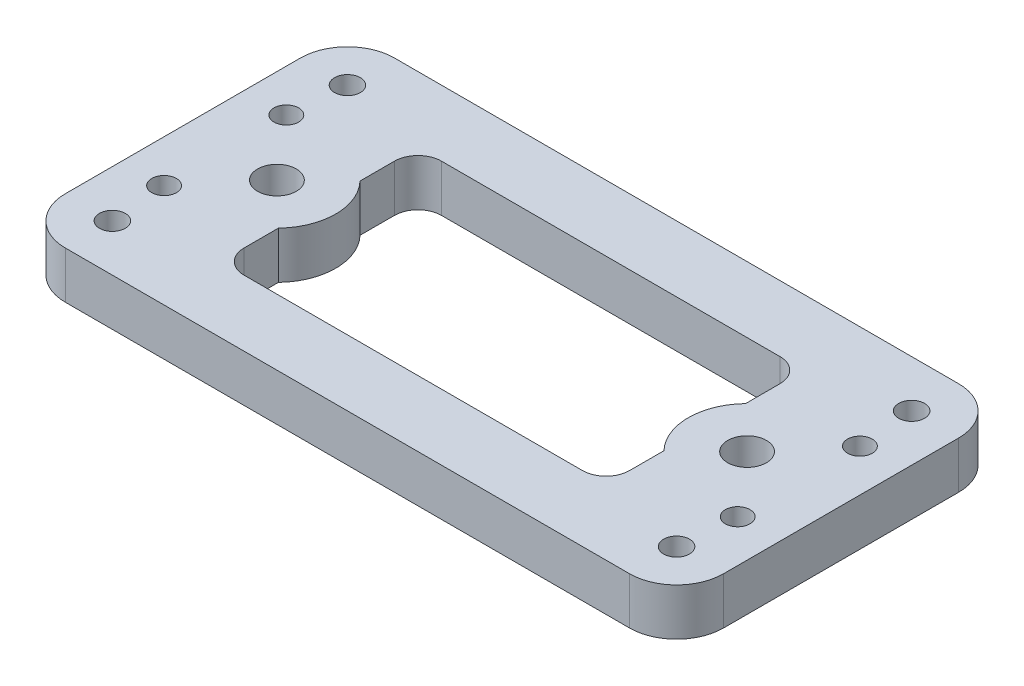
ISO-10303-21;
HEADER;
FILE_DESCRIPTION(('STEP AP214'),'2;1');
FILE_NAME('part.step','',(''),(''),'','','');
FILE_SCHEMA(('AUTOMOTIVE_DESIGN { 1 0 10303 214 1 1 1 1 }'));
ENDSEC;
DATA;
#1=APPLICATION_CONTEXT('core data for automotive mechanical design processes');
#2=APPLICATION_PROTOCOL_DEFINITION('international standard','automotive_design',2000,#1);
#3=PRODUCT_CONTEXT('',#1,'mechanical');
#4=PRODUCT('Part','Part','',(#3));
#5=PRODUCT_RELATED_PRODUCT_CATEGORY('part','',(#4));
#6=PRODUCT_DEFINITION_FORMATION('','',#4);
#7=PRODUCT_DEFINITION_CONTEXT('part definition',#1,'design');
#8=PRODUCT_DEFINITION('design','',#6,#7);
#9=PRODUCT_DEFINITION_SHAPE('','',#8);
#10=(LENGTH_UNIT() NAMED_UNIT(*) SI_UNIT(.MILLI.,.METRE.));
#11=(NAMED_UNIT(*) PLANE_ANGLE_UNIT() SI_UNIT($,.RADIAN.));
#12=(NAMED_UNIT(*) SI_UNIT($,.STERADIAN.) SOLID_ANGLE_UNIT());
#13=UNCERTAINTY_MEASURE_WITH_UNIT(LENGTH_MEASURE(1.E-05),#10,'distance_accuracy_value','');
#14=(GEOMETRIC_REPRESENTATION_CONTEXT(3) GLOBAL_UNCERTAINTY_ASSIGNED_CONTEXT((#13)) GLOBAL_UNIT_ASSIGNED_CONTEXT((#10,
#11,#12)) REPRESENTATION_CONTEXT('',''));
#15=CARTESIAN_POINT('',(0.,0.,0.));
#16=DIRECTION('',(0.,0.,1.));
#17=DIRECTION('',(1.,0.,0.));
#18=AXIS2_PLACEMENT_3D('',#15,#16,#17);
#19=CARTESIAN_POINT('',(41.,10.,-21.));
#20=DIRECTION('',(-1.,0.,0.));
#21=DIRECTION('',(0.,0.,1.));
#22=AXIS2_PLACEMENT_3D('',#19,#20,#21);
#23=PLANE('',#22);
#24=DIRECTION('',(0.,0.,-1.));
#25=VECTOR('',#24,1.);
#26=CARTESIAN_POINT('',(41.,0.,-21.));
#27=LINE('',#26,#25);
#28=CARTESIAN_POINT('',(41.,0.,16.));
#29=VERTEX_POINT('',#28);
#30=CARTESIAN_POINT('',(41.,0.,8.67467578644872));
#31=VERTEX_POINT('',#30);
#32=EDGE_CURVE('E266',#29,#31,#27,.T.);
#33=ORIENTED_EDGE('',*,*,#32,.F.);
#34=DIRECTION('',(0.,-1.,0.));
#35=VECTOR('',#34,1.);
#36=CARTESIAN_POINT('',(41.,10.,16.));
#37=LINE('',#36,#35);
#38=CARTESIAN_POINT('',(41.,10.,16.));
#39=VERTEX_POINT('',#38);
#40=EDGE_CURVE('E339',#29,#39,#37,.F.);
#41=ORIENTED_EDGE('',*,*,#40,.T.);
#42=DIRECTION('',(0.,0.,-1.));
#43=VECTOR('',#42,1.);
#44=CARTESIAN_POINT('',(41.,10.,-21.));
#45=LINE('',#44,#43);
#46=CARTESIAN_POINT('',(41.,10.,8.67467578644872));
#47=VERTEX_POINT('',#46);
#48=EDGE_CURVE('E182',#39,#47,#45,.T.);
#49=ORIENTED_EDGE('',*,*,#48,.T.);
#50=DIRECTION('',(0.,1.,0.));
#51=VECTOR('',#50,1.);
#52=CARTESIAN_POINT('',(41.,0.,8.67467578644872));
#53=LINE('',#52,#51);
#54=EDGE_CURVE('E194',#31,#47,#53,.T.);
#55=ORIENTED_EDGE('',*,*,#54,.F.);
#56=EDGE_LOOP('',(#33,#41,#49,#55));
#57=FACE_BOUND('',#56,.T.);
#58=ADVANCED_FACE('F35',(#57),#23,.T.);
#59=CARTESIAN_POINT('',(-41.,10.,-21.));
#60=DIRECTION('',(1.,0.,0.));
#61=DIRECTION('',(0.,0.,-1.));
#62=AXIS2_PLACEMENT_3D('',#59,#60,#61);
#63=PLANE('',#62);
#64=DIRECTION('',(0.,0.,1.));
#65=VECTOR('',#64,1.);
#66=CARTESIAN_POINT('',(-41.,0.,-21.));
#67=LINE('',#66,#65);
#68=CARTESIAN_POINT('',(-41.,0.,-16.));
#69=VERTEX_POINT('',#68);
#70=CARTESIAN_POINT('',(-41.,0.,-8.67467578644872));
#71=VERTEX_POINT('',#70);
#72=EDGE_CURVE('E271',#69,#71,#67,.T.);
#73=ORIENTED_EDGE('',*,*,#72,.F.);
#74=DIRECTION('',(0.,-1.,0.));
#75=VECTOR('',#74,1.);
#76=CARTESIAN_POINT('',(-41.,10.,-16.));
#77=LINE('',#76,#75);
#78=CARTESIAN_POINT('',(-41.,10.,-16.));
#79=VERTEX_POINT('',#78);
#80=EDGE_CURVE('E50',#69,#79,#77,.F.);
#81=ORIENTED_EDGE('',*,*,#80,.T.);
#82=DIRECTION('',(0.,0.,1.));
#83=VECTOR('',#82,1.);
#84=CARTESIAN_POINT('',(-41.,10.,-21.));
#85=LINE('',#84,#83);
#86=CARTESIAN_POINT('',(-41.,10.,-8.67467578644872));
#87=VERTEX_POINT('',#86);
#88=EDGE_CURVE('E260',#79,#87,#85,.T.);
#89=ORIENTED_EDGE('',*,*,#88,.T.);
#90=DIRECTION('',(0.,1.,0.));
#91=VECTOR('',#90,1.);
#92=CARTESIAN_POINT('',(-41.,0.,-8.67467578644872));
#93=LINE('',#92,#91);
#94=EDGE_CURVE('E212',#71,#87,#93,.T.);
#95=ORIENTED_EDGE('',*,*,#94,.F.);
#96=EDGE_LOOP('',(#73,#81,#89,#95));
#97=FACE_BOUND('',#96,.T.);
#98=ADVANCED_FACE('F401',(#97),#63,.T.);
#99=CARTESIAN_POINT('',(70.,10.,35.));
#100=DIRECTION('',(0.,1.,0.));
#101=DIRECTION('',(0.,0.,1.));
#102=AXIS2_PLACEMENT_3D('',#99,#100,#101);
#103=PLANE('',#102);
#104=CARTESIAN_POINT('',(61.,10.,13.));
#105=DIRECTION('',(0.,1.,0.));
#106=DIRECTION('',(0.,0.,1.));
#107=AXIS2_PLACEMENT_3D('',#104,#105,#106);
#108=CIRCLE('',#107,2.62500000000001);
#109=CARTESIAN_POINT('',(61.,10.,15.625));
#110=VERTEX_POINT('',#109);
#111=EDGE_CURVE('E742',#110,#110,#108,.T.);
#112=ORIENTED_EDGE('',*,*,#111,.F.);
#113=EDGE_LOOP('',(#112));
#114=FACE_BOUND('',#113,.T.);
#115=CARTESIAN_POINT('',(61.,10.,-13.));
#116=DIRECTION('',(0.,1.,0.));
#117=DIRECTION('',(0.,0.,1.));
#118=AXIS2_PLACEMENT_3D('',#115,#116,#117);
#119=CIRCLE('',#118,2.625);
#120=CARTESIAN_POINT('',(61.,10.,-10.375));
#121=VERTEX_POINT('',#120);
#122=EDGE_CURVE('E744',#121,#121,#119,.T.);
#123=ORIENTED_EDGE('',*,*,#122,.F.);
#124=EDGE_LOOP('',(#123));
#125=FACE_BOUND('',#124,.T.);
#126=CARTESIAN_POINT('',(-61.,10.,13.));
#127=DIRECTION('',(0.,1.,0.));
#128=DIRECTION('',(0.,0.,1.));
#129=AXIS2_PLACEMENT_3D('',#126,#127,#128);
#130=CIRCLE('',#129,2.625);
#131=CARTESIAN_POINT('',(-61.,10.,15.625));
#132=VERTEX_POINT('',#131);
#133=EDGE_CURVE('E748',#132,#132,#130,.T.);
#134=ORIENTED_EDGE('',*,*,#133,.F.);
#135=EDGE_LOOP('',(#134));
#136=FACE_BOUND('',#135,.T.);
#137=CARTESIAN_POINT('',(-61.,10.,-13.));
#138=DIRECTION('',(0.,1.,0.));
#139=DIRECTION('',(0.,0.,1.));
#140=AXIS2_PLACEMENT_3D('',#137,#138,#139);
#141=CIRCLE('',#140,2.625);
#142=CARTESIAN_POINT('',(-61.,10.,-10.375));
#143=VERTEX_POINT('',#142);
#144=EDGE_CURVE('E204',#143,#143,#141,.T.);
#145=ORIENTED_EDGE('',*,*,#144,.F.);
#146=EDGE_LOOP('',(#145));
#147=FACE_BOUND('',#146,.T.);
#148=CARTESIAN_POINT('',(50.,10.,0.));
#149=DIRECTION('',(0.,1.,0.));
#150=DIRECTION('',(0.,0.,-1.));
#151=AXIS2_PLACEMENT_3D('',#148,#149,#150);
#152=CIRCLE('',#151,4.12500000000001);
#153=CARTESIAN_POINT('',(50.,10.,-4.12500000000001));
#154=VERTEX_POINT('',#153);
#155=EDGE_CURVE('E218',#154,#154,#152,.T.);
#156=ORIENTED_EDGE('',*,*,#155,.F.);
#157=EDGE_LOOP('',(#156));
#158=FACE_BOUND('',#157,.T.);
#159=CARTESIAN_POINT('',(-50.,10.,0.));
#160=DIRECTION('',(0.,1.,0.));
#161=DIRECTION('',(0.,0.,1.));
#162=AXIS2_PLACEMENT_3D('',#159,#160,#161);
#163=CIRCLE('',#162,4.12500000000001);
#164=CARTESIAN_POINT('',(-50.,10.,4.12500000000001));
#165=VERTEX_POINT('',#164);
#166=EDGE_CURVE('E224',#165,#165,#163,.T.);
#167=ORIENTED_EDGE('',*,*,#166,.F.);
#168=EDGE_LOOP('',(#167));
#169=FACE_BOUND('',#168,.T.);
#170=CARTESIAN_POINT('',(60.,10.,-25.));
#171=DIRECTION('',(0.,1.,0.));
#172=DIRECTION('',(0.,0.,1.));
#173=AXIS2_PLACEMENT_3D('',#170,#171,#172);
#174=CIRCLE('',#173,2.75);
#175=CARTESIAN_POINT('',(60.,10.,-22.25));
#176=VERTEX_POINT('',#175);
#177=EDGE_CURVE('E230',#176,#176,#174,.T.);
#178=ORIENTED_EDGE('',*,*,#177,.F.);
#179=EDGE_LOOP('',(#178));
#180=FACE_BOUND('',#179,.T.);
#181=CARTESIAN_POINT('',(60.,10.,25.));
#182=DIRECTION('',(0.,1.,0.));
#183=DIRECTION('',(0.,0.,-1.));
#184=AXIS2_PLACEMENT_3D('',#181,#182,#183);
#185=CIRCLE('',#184,2.75);
#186=CARTESIAN_POINT('',(60.,10.,22.25));
#187=VERTEX_POINT('',#186);
#188=EDGE_CURVE('E236',#187,#187,#185,.T.);
#189=ORIENTED_EDGE('',*,*,#188,.F.);
#190=EDGE_LOOP('',(#189));
#191=FACE_BOUND('',#190,.T.);
#192=CARTESIAN_POINT('',(-60.,10.,-25.));
#193=DIRECTION('',(0.,1.,0.));
#194=DIRECTION('',(0.,0.,-1.));
#195=AXIS2_PLACEMENT_3D('',#192,#193,#194);
#196=CIRCLE('',#195,2.75);
#197=CARTESIAN_POINT('',(-60.,10.,-27.75));
#198=VERTEX_POINT('',#197);
#199=EDGE_CURVE('E242',#198,#198,#196,.T.);
#200=ORIENTED_EDGE('',*,*,#199,.F.);
#201=EDGE_LOOP('',(#200));
#202=FACE_BOUND('',#201,.T.);
#203=CARTESIAN_POINT('',(-60.,10.,25.));
#204=DIRECTION('',(0.,1.,0.));
#205=DIRECTION('',(0.,0.,1.));
#206=AXIS2_PLACEMENT_3D('',#203,#204,#205);
#207=CIRCLE('',#206,2.75);
#208=CARTESIAN_POINT('',(-60.,10.,27.75));
#209=VERTEX_POINT('',#208);
#210=EDGE_CURVE('E248',#209,#209,#207,.T.);
#211=ORIENTED_EDGE('',*,*,#210,.F.);
#212=EDGE_LOOP('',(#211));
#213=FACE_BOUND('',#212,.T.);
#214=DIRECTION('',(1.,0.,0.));
#215=VECTOR('',#214,1.);
#216=CARTESIAN_POINT('',(-70.,10.,35.));
#217=LINE('',#216,#215);
#218=CARTESIAN_POINT('',(-60.,10.,35.));
#219=VERTEX_POINT('',#218);
#220=CARTESIAN_POINT('',(60.,10.,35.));
#221=VERTEX_POINT('',#220);
#222=EDGE_CURVE('E285',#219,#221,#217,.T.);
#223=ORIENTED_EDGE('',*,*,#222,.T.);
#224=CARTESIAN_POINT('',(60.,10.,25.));
#225=DIRECTION('',(0.,1.,0.));
#226=DIRECTION('',(0.,0.,1.));
#227=AXIS2_PLACEMENT_3D('',#224,#225,#226);
#228=CIRCLE('',#227,10.);
#229=CARTESIAN_POINT('',(70.,10.,25.));
#230=VERTEX_POINT('',#229);
#231=EDGE_CURVE('E322',#221,#230,#228,.T.);
#232=ORIENTED_EDGE('',*,*,#231,.T.);
#233=DIRECTION('',(0.,0.,-1.));
#234=VECTOR('',#233,1.);
#235=CARTESIAN_POINT('',(70.,10.,-35.));
#236=LINE('',#235,#234);
#237=CARTESIAN_POINT('',(70.,10.,-25.));
#238=VERTEX_POINT('',#237);
#239=EDGE_CURVE('E275',#230,#238,#236,.T.);
#240=ORIENTED_EDGE('',*,*,#239,.T.);
#241=CARTESIAN_POINT('',(60.,10.,-25.));
#242=DIRECTION('',(0.,1.,0.));
#243=DIRECTION('',(0.,0.,1.));
#244=AXIS2_PLACEMENT_3D('',#241,#242,#243);
#245=CIRCLE('',#244,10.);
#246=CARTESIAN_POINT('',(60.,10.,-35.));
#247=VERTEX_POINT('',#246);
#248=EDGE_CURVE('E320',#238,#247,#245,.T.);
#249=ORIENTED_EDGE('',*,*,#248,.T.);
#250=DIRECTION('',(-1.,0.,0.));
#251=VECTOR('',#250,1.);
#252=CARTESIAN_POINT('',(-70.,10.,-35.));
#253=LINE('',#252,#251);
#254=CARTESIAN_POINT('',(-60.,10.,-35.));
#255=VERTEX_POINT('',#254);
#256=EDGE_CURVE('E278',#247,#255,#253,.T.);
#257=ORIENTED_EDGE('',*,*,#256,.T.);
#258=CARTESIAN_POINT('',(-60.,10.,-25.));
#259=DIRECTION('',(0.,1.,0.));
#260=DIRECTION('',(0.,0.,1.));
#261=AXIS2_PLACEMENT_3D('',#258,#259,#260);
#262=CIRCLE('',#261,10.);
#263=CARTESIAN_POINT('',(-70.,10.,-25.));
#264=VERTEX_POINT('',#263);
#265=EDGE_CURVE('E318',#255,#264,#262,.T.);
#266=ORIENTED_EDGE('',*,*,#265,.T.);
#267=DIRECTION('',(0.,0.,1.));
#268=VECTOR('',#267,1.);
#269=CARTESIAN_POINT('',(-70.,10.,-35.));
#270=LINE('',#269,#268);
#271=CARTESIAN_POINT('',(-70.,10.,25.));
#272=VERTEX_POINT('',#271);
#273=EDGE_CURVE('E282',#264,#272,#270,.T.);
#274=ORIENTED_EDGE('',*,*,#273,.T.);
#275=CARTESIAN_POINT('',(-60.,10.,25.));
#276=DIRECTION('',(0.,1.,0.));
#277=DIRECTION('',(0.,0.,1.));
#278=AXIS2_PLACEMENT_3D('',#275,#276,#277);
#279=CIRCLE('',#278,10.);
#280=EDGE_CURVE('E316',#272,#219,#279,.T.);
#281=ORIENTED_EDGE('',*,*,#280,.T.);
#282=EDGE_LOOP('',(#223,#232,#240,#249,#257,#266,#274,#281));
#283=FACE_BOUND('',#282,.T.);
#284=DIRECTION('',(-1.,0.,0.));
#285=VECTOR('',#284,1.);
#286=CARTESIAN_POINT('',(-41.,10.,-21.));
#287=LINE('',#286,#285);
#288=CARTESIAN_POINT('',(36.,10.,-21.));
#289=VERTEX_POINT('',#288);
#290=CARTESIAN_POINT('',(-36.,10.,-21.));
#291=VERTEX_POINT('',#290);
#292=EDGE_CURVE('E256',#289,#291,#287,.T.);
#293=ORIENTED_EDGE('',*,*,#292,.F.);
#294=CARTESIAN_POINT('',(36.,10.,-16.));
#295=DIRECTION('',(0.,1.,0.));
#296=DIRECTION('',(0.,0.,1.));
#297=AXIS2_PLACEMENT_3D('',#294,#295,#296);
#298=CIRCLE('',#297,5.);
#299=CARTESIAN_POINT('',(41.,10.,-16.));
#300=VERTEX_POINT('',#299);
#301=EDGE_CURVE('E178',#289,#300,#298,.F.);
#302=ORIENTED_EDGE('',*,*,#301,.T.);
#303=CARTESIAN_POINT('',(41.,10.,-8.67467578644872));
#304=VERTEX_POINT('',#303);
#305=EDGE_CURVE('E170',#304,#300,#45,.T.);
#306=ORIENTED_EDGE('',*,*,#305,.F.);
#307=CARTESIAN_POINT('',(50.,10.,0.));
#308=DIRECTION('',(0.,1.,0.));
#309=DIRECTION('',(0.,0.,1.));
#310=AXIS2_PLACEMENT_3D('',#307,#308,#309);
#311=CIRCLE('',#310,12.5);
#312=EDGE_CURVE('E176',#304,#47,#311,.T.);
#313=ORIENTED_EDGE('',*,*,#312,.T.);
#314=ORIENTED_EDGE('',*,*,#48,.F.);
#315=CARTESIAN_POINT('',(36.,10.,16.));
#316=DIRECTION('',(0.,1.,0.));
#317=DIRECTION('',(0.,0.,1.));
#318=AXIS2_PLACEMENT_3D('',#315,#316,#317);
#319=CIRCLE('',#318,5.);
#320=CARTESIAN_POINT('',(36.,10.,21.));
#321=VERTEX_POINT('',#320);
#322=EDGE_CURVE('E354',#39,#321,#319,.F.);
#323=ORIENTED_EDGE('',*,*,#322,.T.);
#324=DIRECTION('',(1.,0.,0.));
#325=VECTOR('',#324,1.);
#326=CARTESIAN_POINT('',(-41.,10.,21.));
#327=LINE('',#326,#325);
#328=CARTESIAN_POINT('',(-36.,10.,21.));
#329=VERTEX_POINT('',#328);
#330=EDGE_CURVE('E262',#329,#321,#327,.T.);
#331=ORIENTED_EDGE('',*,*,#330,.F.);
#332=CARTESIAN_POINT('',(-36.,10.,16.));
#333=DIRECTION('',(0.,1.,0.));
#334=DIRECTION('',(0.,0.,1.));
#335=AXIS2_PLACEMENT_3D('',#332,#333,#334);
#336=CIRCLE('',#335,5.);
#337=CARTESIAN_POINT('',(-41.,10.,16.));
#338=VERTEX_POINT('',#337);
#339=EDGE_CURVE('E361',#329,#338,#336,.F.);
#340=ORIENTED_EDGE('',*,*,#339,.T.);
#341=CARTESIAN_POINT('',(-41.,10.,8.67467578644872));
#342=VERTEX_POINT('',#341);
#343=EDGE_CURVE('E259',#342,#338,#85,.T.);
#344=ORIENTED_EDGE('',*,*,#343,.F.);
#345=CARTESIAN_POINT('',(-50.,10.,0.));
#346=DIRECTION('',(0.,1.,0.));
#347=DIRECTION('',(0.,0.,-1.));
#348=AXIS2_PLACEMENT_3D('',#345,#346,#347);
#349=CIRCLE('',#348,12.5);
#350=EDGE_CURVE('E193',#342,#87,#349,.T.);
#351=ORIENTED_EDGE('',*,*,#350,.T.);
#352=ORIENTED_EDGE('',*,*,#88,.F.);
#353=CARTESIAN_POINT('',(-36.,10.,-16.));
#354=DIRECTION('',(0.,1.,0.));
#355=DIRECTION('',(0.,0.,1.));
#356=AXIS2_PLACEMENT_3D('',#353,#354,#355);
#357=CIRCLE('',#356,5.);
#358=EDGE_CURVE('E11',#79,#291,#357,.F.);
#359=ORIENTED_EDGE('',*,*,#358,.T.);
#360=EDGE_LOOP('',(#293,#302,#306,#313,#314,#323,#331,#340,#344,#351,#352,#359));
#361=FACE_BOUND('',#360,.T.);
#362=ADVANCED_FACE('F173',(#114,#125,#136,#147,#158,#169,#180,#191,#202,#213,#283,#361),#103,.T.);
#363=CARTESIAN_POINT('',(70.,0.,35.));
#364=DIRECTION('',(0.,1.,0.));
#365=DIRECTION('',(0.,0.,1.));
#366=AXIS2_PLACEMENT_3D('',#363,#364,#365);
#367=PLANE('',#366);
#368=CARTESIAN_POINT('',(61.,0.,13.));
#369=DIRECTION('',(0.,1.,0.));
#370=DIRECTION('',(0.,0.,1.));
#371=AXIS2_PLACEMENT_3D('',#368,#369,#370);
#372=CIRCLE('',#371,2.62500000000001);
#373=CARTESIAN_POINT('',(61.,0.,15.625));
#374=VERTEX_POINT('',#373);
#375=EDGE_CURVE('E486',#374,#374,#372,.T.);
#376=ORIENTED_EDGE('',*,*,#375,.T.);
#377=EDGE_LOOP('',(#376));
#378=FACE_BOUND('',#377,.T.);
#379=CARTESIAN_POINT('',(61.,0.,-13.));
#380=DIRECTION('',(0.,1.,0.));
#381=DIRECTION('',(0.,0.,1.));
#382=AXIS2_PLACEMENT_3D('',#379,#380,#381);
#383=CIRCLE('',#382,2.625);
#384=CARTESIAN_POINT('',(61.,0.,-10.375));
#385=VERTEX_POINT('',#384);
#386=EDGE_CURVE('E490',#385,#385,#383,.T.);
#387=ORIENTED_EDGE('',*,*,#386,.T.);
#388=EDGE_LOOP('',(#387));
#389=FACE_BOUND('',#388,.T.);
#390=CARTESIAN_POINT('',(-61.,0.,13.));
#391=DIRECTION('',(0.,1.,0.));
#392=DIRECTION('',(0.,0.,1.));
#393=AXIS2_PLACEMENT_3D('',#390,#391,#392);
#394=CIRCLE('',#393,2.625);
#395=CARTESIAN_POINT('',(-61.,0.,15.625));
#396=VERTEX_POINT('',#395);
#397=EDGE_CURVE('E494',#396,#396,#394,.T.);
#398=ORIENTED_EDGE('',*,*,#397,.T.);
#399=EDGE_LOOP('',(#398));
#400=FACE_BOUND('',#399,.T.);
#401=CARTESIAN_POINT('',(-61.,0.,-13.));
#402=DIRECTION('',(0.,1.,0.));
#403=DIRECTION('',(0.,0.,1.));
#404=AXIS2_PLACEMENT_3D('',#401,#402,#403);
#405=CIRCLE('',#404,2.625);
#406=CARTESIAN_POINT('',(-61.,0.,-10.375));
#407=VERTEX_POINT('',#406);
#408=EDGE_CURVE('E200',#407,#407,#405,.T.);
#409=ORIENTED_EDGE('',*,*,#408,.T.);
#410=EDGE_LOOP('',(#409));
#411=FACE_BOUND('',#410,.T.);
#412=CARTESIAN_POINT('',(50.,0.,0.));
#413=DIRECTION('',(0.,1.,0.));
#414=DIRECTION('',(0.,0.,-1.));
#415=AXIS2_PLACEMENT_3D('',#412,#413,#414);
#416=CIRCLE('',#415,4.12500000000001);
#417=CARTESIAN_POINT('',(50.,0.,-4.12500000000001));
#418=VERTEX_POINT('',#417);
#419=EDGE_CURVE('E221',#418,#418,#416,.T.);
#420=ORIENTED_EDGE('',*,*,#419,.T.);
#421=EDGE_LOOP('',(#420));
#422=FACE_BOUND('',#421,.T.);
#423=CARTESIAN_POINT('',(-50.,0.,0.));
#424=DIRECTION('',(0.,1.,0.));
#425=DIRECTION('',(0.,0.,1.));
#426=AXIS2_PLACEMENT_3D('',#423,#424,#425);
#427=CIRCLE('',#426,4.12500000000001);
#428=CARTESIAN_POINT('',(-50.,0.,4.12500000000001));
#429=VERTEX_POINT('',#428);
#430=EDGE_CURVE('E227',#429,#429,#427,.T.);
#431=ORIENTED_EDGE('',*,*,#430,.T.);
#432=EDGE_LOOP('',(#431));
#433=FACE_BOUND('',#432,.T.);
#434=CARTESIAN_POINT('',(60.,0.,-25.));
#435=DIRECTION('',(0.,1.,0.));
#436=DIRECTION('',(0.,0.,1.));
#437=AXIS2_PLACEMENT_3D('',#434,#435,#436);
#438=CIRCLE('',#437,2.75);
#439=CARTESIAN_POINT('',(60.,0.,-22.25));
#440=VERTEX_POINT('',#439);
#441=EDGE_CURVE('E233',#440,#440,#438,.T.);
#442=ORIENTED_EDGE('',*,*,#441,.T.);
#443=EDGE_LOOP('',(#442));
#444=FACE_BOUND('',#443,.T.);
#445=CARTESIAN_POINT('',(60.,0.,25.));
#446=DIRECTION('',(0.,1.,0.));
#447=DIRECTION('',(0.,0.,-1.));
#448=AXIS2_PLACEMENT_3D('',#445,#446,#447);
#449=CIRCLE('',#448,2.75);
#450=CARTESIAN_POINT('',(60.,0.,22.25));
#451=VERTEX_POINT('',#450);
#452=EDGE_CURVE('E239',#451,#451,#449,.T.);
#453=ORIENTED_EDGE('',*,*,#452,.T.);
#454=EDGE_LOOP('',(#453));
#455=FACE_BOUND('',#454,.T.);
#456=CARTESIAN_POINT('',(-60.,0.,-25.));
#457=DIRECTION('',(0.,1.,0.));
#458=DIRECTION('',(0.,0.,-1.));
#459=AXIS2_PLACEMENT_3D('',#456,#457,#458);
#460=CIRCLE('',#459,2.75);
#461=CARTESIAN_POINT('',(-60.,0.,-27.75));
#462=VERTEX_POINT('',#461);
#463=EDGE_CURVE('E245',#462,#462,#460,.T.);
#464=ORIENTED_EDGE('',*,*,#463,.T.);
#465=EDGE_LOOP('',(#464));
#466=FACE_BOUND('',#465,.T.);
#467=CARTESIAN_POINT('',(-60.,0.,25.));
#468=DIRECTION('',(0.,1.,0.));
#469=DIRECTION('',(0.,0.,1.));
#470=AXIS2_PLACEMENT_3D('',#467,#468,#469);
#471=CIRCLE('',#470,2.75);
#472=CARTESIAN_POINT('',(-60.,0.,27.75));
#473=VERTEX_POINT('',#472);
#474=EDGE_CURVE('E251',#473,#473,#471,.T.);
#475=ORIENTED_EDGE('',*,*,#474,.T.);
#476=EDGE_LOOP('',(#475));
#477=FACE_BOUND('',#476,.T.);
#478=DIRECTION('',(0.,0.,-1.));
#479=VECTOR('',#478,1.);
#480=CARTESIAN_POINT('',(70.,0.,-35.));
#481=LINE('',#480,#479);
#482=CARTESIAN_POINT('',(70.,0.,25.));
#483=VERTEX_POINT('',#482);
#484=CARTESIAN_POINT('',(70.,0.,-25.));
#485=VERTEX_POINT('',#484);
#486=EDGE_CURVE('E265',#483,#485,#481,.T.);
#487=ORIENTED_EDGE('',*,*,#486,.F.);
#488=CARTESIAN_POINT('',(60.,0.,25.));
#489=DIRECTION('',(0.,1.,0.));
#490=DIRECTION('',(0.,0.,1.));
#491=AXIS2_PLACEMENT_3D('',#488,#489,#490);
#492=CIRCLE('',#491,10.);
#493=CARTESIAN_POINT('',(60.,0.,35.));
#494=VERTEX_POINT('',#493);
#495=EDGE_CURVE('E309',#483,#494,#492,.F.);
#496=ORIENTED_EDGE('',*,*,#495,.T.);
#497=DIRECTION('',(1.,0.,0.));
#498=VECTOR('',#497,1.);
#499=CARTESIAN_POINT('',(-70.,0.,35.));
#500=LINE('',#499,#498);
#501=CARTESIAN_POINT('',(-60.,0.,35.));
#502=VERTEX_POINT('',#501);
#503=EDGE_CURVE('E279',#502,#494,#500,.T.);
#504=ORIENTED_EDGE('',*,*,#503,.F.);
#505=CARTESIAN_POINT('',(-60.,0.,25.));
#506=DIRECTION('',(0.,1.,0.));
#507=DIRECTION('',(0.,0.,1.));
#508=AXIS2_PLACEMENT_3D('',#505,#506,#507);
#509=CIRCLE('',#508,10.);
#510=CARTESIAN_POINT('',(-70.,0.,25.));
#511=VERTEX_POINT('',#510);
#512=EDGE_CURVE('E303',#502,#511,#509,.F.);
#513=ORIENTED_EDGE('',*,*,#512,.T.);
#514=DIRECTION('',(0.,0.,1.));
#515=VECTOR('',#514,1.);
#516=CARTESIAN_POINT('',(-70.,0.,-35.));
#517=LINE('',#516,#515);
#518=CARTESIAN_POINT('',(-70.,0.,-25.));
#519=VERTEX_POINT('',#518);
#520=EDGE_CURVE('E294',#519,#511,#517,.T.);
#521=ORIENTED_EDGE('',*,*,#520,.F.);
#522=CARTESIAN_POINT('',(-60.,0.,-25.));
#523=DIRECTION('',(0.,1.,0.));
#524=DIRECTION('',(0.,0.,1.));
#525=AXIS2_PLACEMENT_3D('',#522,#523,#524);
#526=CIRCLE('',#525,10.);
#527=CARTESIAN_POINT('',(-60.,0.,-35.));
#528=VERTEX_POINT('',#527);
#529=EDGE_CURVE('E305',#519,#528,#526,.F.);
#530=ORIENTED_EDGE('',*,*,#529,.T.);
#531=DIRECTION('',(-1.,0.,0.));
#532=VECTOR('',#531,1.);
#533=CARTESIAN_POINT('',(-70.,0.,-35.));
#534=LINE('',#533,#532);
#535=CARTESIAN_POINT('',(60.,0.,-35.));
#536=VERTEX_POINT('',#535);
#537=EDGE_CURVE('E291',#536,#528,#534,.T.);
#538=ORIENTED_EDGE('',*,*,#537,.F.);
#539=CARTESIAN_POINT('',(60.,0.,-25.));
#540=DIRECTION('',(0.,1.,0.));
#541=DIRECTION('',(0.,0.,1.));
#542=AXIS2_PLACEMENT_3D('',#539,#540,#541);
#543=CIRCLE('',#542,10.);
#544=EDGE_CURVE('E307',#536,#485,#543,.F.);
#545=ORIENTED_EDGE('',*,*,#544,.T.);
#546=EDGE_LOOP('',(#487,#496,#504,#513,#521,#530,#538,#545));
#547=FACE_BOUND('',#546,.T.);
#548=DIRECTION('',(1.,0.,0.));
#549=VECTOR('',#548,1.);
#550=CARTESIAN_POINT('',(-41.,0.,21.));
#551=LINE('',#550,#549);
#552=CARTESIAN_POINT('',(-36.,0.,21.));
#553=VERTEX_POINT('',#552);
#554=CARTESIAN_POINT('',(36.,0.,21.));
#555=VERTEX_POINT('',#554);
#556=EDGE_CURVE('E183',#553,#555,#551,.T.);
#557=ORIENTED_EDGE('',*,*,#556,.T.);
#558=CARTESIAN_POINT('',(36.,0.,16.));
#559=DIRECTION('',(0.,1.,0.));
#560=DIRECTION('',(0.,0.,1.));
#561=AXIS2_PLACEMENT_3D('',#558,#559,#560);
#562=CIRCLE('',#561,5.);
#563=EDGE_CURVE('E352',#555,#29,#562,.T.);
#564=ORIENTED_EDGE('',*,*,#563,.T.);
#565=ORIENTED_EDGE('',*,*,#32,.T.);
#566=CARTESIAN_POINT('',(50.,0.,0.));
#567=DIRECTION('',(0.,1.,0.));
#568=DIRECTION('',(0.,0.,1.));
#569=AXIS2_PLACEMENT_3D('',#566,#567,#568);
#570=CIRCLE('',#569,12.5);
#571=CARTESIAN_POINT('',(41.,0.,-8.67467578644872));
#572=VERTEX_POINT('',#571);
#573=EDGE_CURVE('E199',#572,#31,#570,.T.);
#574=ORIENTED_EDGE('',*,*,#573,.F.);
#575=CARTESIAN_POINT('',(41.,0.,-16.));
#576=VERTEX_POINT('',#575);
#577=EDGE_CURVE('E189',#572,#576,#27,.T.);
#578=ORIENTED_EDGE('',*,*,#577,.T.);
#579=CARTESIAN_POINT('',(36.,0.,-16.));
#580=DIRECTION('',(0.,1.,0.));
#581=DIRECTION('',(0.,0.,1.));
#582=AXIS2_PLACEMENT_3D('',#579,#580,#581);
#583=CIRCLE('',#582,5.);
#584=CARTESIAN_POINT('',(36.,0.,-21.));
#585=VERTEX_POINT('',#584);
#586=EDGE_CURVE('E356',#576,#585,#583,.T.);
#587=ORIENTED_EDGE('',*,*,#586,.T.);
#588=DIRECTION('',(-1.,0.,0.));
#589=VECTOR('',#588,1.);
#590=CARTESIAN_POINT('',(-41.,0.,-21.));
#591=LINE('',#590,#589);
#592=CARTESIAN_POINT('',(-36.,0.,-21.));
#593=VERTEX_POINT('',#592);
#594=EDGE_CURVE('E268',#585,#593,#591,.T.);
#595=ORIENTED_EDGE('',*,*,#594,.T.);
#596=CARTESIAN_POINT('',(-36.,0.,-16.));
#597=DIRECTION('',(0.,1.,0.));
#598=DIRECTION('',(0.,0.,1.));
#599=AXIS2_PLACEMENT_3D('',#596,#597,#598);
#600=CIRCLE('',#599,5.);
#601=EDGE_CURVE('E43',#593,#69,#600,.T.);
#602=ORIENTED_EDGE('',*,*,#601,.T.);
#603=ORIENTED_EDGE('',*,*,#72,.T.);
#604=CARTESIAN_POINT('',(-50.,0.,0.));
#605=DIRECTION('',(0.,1.,0.));
#606=DIRECTION('',(0.,0.,-1.));
#607=AXIS2_PLACEMENT_3D('',#604,#605,#606);
#608=CIRCLE('',#607,12.5);
#609=CARTESIAN_POINT('',(-41.,0.,8.67467578644872));
#610=VERTEX_POINT('',#609);
#611=EDGE_CURVE('E209',#610,#71,#608,.T.);
#612=ORIENTED_EDGE('',*,*,#611,.F.);
#613=CARTESIAN_POINT('',(-41.,0.,16.));
#614=VERTEX_POINT('',#613);
#615=EDGE_CURVE('E270',#610,#614,#67,.T.);
#616=ORIENTED_EDGE('',*,*,#615,.T.);
#617=CARTESIAN_POINT('',(-36.,0.,16.));
#618=DIRECTION('',(0.,1.,0.));
#619=DIRECTION('',(0.,0.,1.));
#620=AXIS2_PLACEMENT_3D('',#617,#618,#619);
#621=CIRCLE('',#620,5.);
#622=EDGE_CURVE('E359',#614,#553,#621,.T.);
#623=ORIENTED_EDGE('',*,*,#622,.T.);
#624=EDGE_LOOP('',(#557,#564,#565,#574,#578,#587,#595,#602,#603,#612,#616,#623));
#625=FACE_BOUND('',#624,.T.);
#626=ADVANCED_FACE('F375',(#378,#389,#400,#411,#422,#433,#444,#455,#466,#477,#547,#625),#367,.F.);
#627=CARTESIAN_POINT('',(70.,10.,-35.));
#628=DIRECTION('',(-1.,0.,0.));
#629=DIRECTION('',(0.,0.,1.));
#630=AXIS2_PLACEMENT_3D('',#627,#628,#629);
#631=PLANE('',#630);
#632=ORIENTED_EDGE('',*,*,#239,.F.);
#633=DIRECTION('',(0.,-1.,0.));
#634=VECTOR('',#633,1.);
#635=CARTESIAN_POINT('',(70.,10.,25.));
#636=LINE('',#635,#634);
#637=EDGE_CURVE('E300',#230,#483,#636,.T.);
#638=ORIENTED_EDGE('',*,*,#637,.T.);
#639=ORIENTED_EDGE('',*,*,#486,.T.);
#640=DIRECTION('',(0.,-1.,0.));
#641=VECTOR('',#640,1.);
#642=CARTESIAN_POINT('',(70.,10.,-25.));
#643=LINE('',#642,#641);
#644=EDGE_CURVE('E288',#485,#238,#643,.F.);
#645=ORIENTED_EDGE('',*,*,#644,.T.);
#646=EDGE_LOOP('',(#632,#638,#639,#645));
#647=FACE_BOUND('',#646,.T.);
#648=ADVANCED_FACE('F428',(#647),#631,.F.);
#649=CARTESIAN_POINT('',(-70.,10.,-35.));
#650=DIRECTION('',(0.,0.,1.));
#651=DIRECTION('',(1.,0.,0.));
#652=AXIS2_PLACEMENT_3D('',#649,#650,#651);
#653=PLANE('',#652);
#654=ORIENTED_EDGE('',*,*,#256,.F.);
#655=DIRECTION('',(0.,-1.,0.));
#656=VECTOR('',#655,1.);
#657=CARTESIAN_POINT('',(60.,10.,-35.));
#658=LINE('',#657,#656);
#659=EDGE_CURVE('E326',#247,#536,#658,.T.);
#660=ORIENTED_EDGE('',*,*,#659,.T.);
#661=ORIENTED_EDGE('',*,*,#537,.T.);
#662=DIRECTION('',(0.,-1.,0.));
#663=VECTOR('',#662,1.);
#664=CARTESIAN_POINT('',(-60.,10.,-35.));
#665=LINE('',#664,#663);
#666=EDGE_CURVE('E324',#528,#255,#665,.F.);
#667=ORIENTED_EDGE('',*,*,#666,.T.);
#668=EDGE_LOOP('',(#654,#660,#661,#667));
#669=FACE_BOUND('',#668,.T.);
#670=ADVANCED_FACE('F421',(#669),#653,.F.);
#671=CARTESIAN_POINT('',(-70.,10.,-35.));
#672=DIRECTION('',(1.,0.,0.));
#673=DIRECTION('',(0.,0.,-1.));
#674=AXIS2_PLACEMENT_3D('',#671,#672,#673);
#675=PLANE('',#674);
#676=ORIENTED_EDGE('',*,*,#273,.F.);
#677=DIRECTION('',(0.,-1.,0.));
#678=VECTOR('',#677,1.);
#679=CARTESIAN_POINT('',(-70.,10.,-25.));
#680=LINE('',#679,#678);
#681=EDGE_CURVE('E331',#264,#519,#680,.T.);
#682=ORIENTED_EDGE('',*,*,#681,.T.);
#683=ORIENTED_EDGE('',*,*,#520,.T.);
#684=DIRECTION('',(0.,-1.,0.));
#685=VECTOR('',#684,1.);
#686=CARTESIAN_POINT('',(-70.,10.,25.));
#687=LINE('',#686,#685);
#688=EDGE_CURVE('E329',#511,#272,#687,.F.);
#689=ORIENTED_EDGE('',*,*,#688,.T.);
#690=EDGE_LOOP('',(#676,#682,#683,#689));
#691=FACE_BOUND('',#690,.T.);
#692=ADVANCED_FACE('F415',(#691),#675,.F.);
#693=CARTESIAN_POINT('',(-70.,10.,35.));
#694=DIRECTION('',(0.,0.,-1.));
#695=DIRECTION('',(-1.,0.,0.));
#696=AXIS2_PLACEMENT_3D('',#693,#694,#695);
#697=PLANE('',#696);
#698=ORIENTED_EDGE('',*,*,#503,.T.);
#699=DIRECTION('',(0.,-1.,0.));
#700=VECTOR('',#699,1.);
#701=CARTESIAN_POINT('',(60.,10.,35.));
#702=LINE('',#701,#700);
#703=EDGE_CURVE('E314',#494,#221,#702,.F.);
#704=ORIENTED_EDGE('',*,*,#703,.T.);
#705=ORIENTED_EDGE('',*,*,#222,.F.);
#706=DIRECTION('',(0.,-1.,0.));
#707=VECTOR('',#706,1.);
#708=CARTESIAN_POINT('',(-60.,10.,35.));
#709=LINE('',#708,#707);
#710=EDGE_CURVE('E311',#219,#502,#709,.T.);
#711=ORIENTED_EDGE('',*,*,#710,.T.);
#712=EDGE_LOOP('',(#698,#704,#705,#711));
#713=FACE_BOUND('',#712,.T.);
#714=ADVANCED_FACE('F410',(#713),#697,.F.);
#715=ORIENTED_EDGE('',*,*,#305,.T.);
#716=DIRECTION('',(0.,-1.,0.));
#717=VECTOR('',#716,1.);
#718=CARTESIAN_POINT('',(41.,0.,-16.));
#719=LINE('',#718,#717);
#720=EDGE_CURVE('E341',#300,#576,#719,.T.);
#721=ORIENTED_EDGE('',*,*,#720,.T.);
#722=ORIENTED_EDGE('',*,*,#577,.F.);
#723=DIRECTION('',(0.,1.,0.));
#724=VECTOR('',#723,1.);
#725=CARTESIAN_POINT('',(41.,0.,-8.67467578644872));
#726=LINE('',#725,#724);
#727=EDGE_CURVE('E186',#572,#304,#726,.T.);
#728=ORIENTED_EDGE('',*,*,#727,.T.);
#729=EDGE_LOOP('',(#715,#721,#722,#728));
#730=FACE_BOUND('',#729,.T.);
#731=ADVANCED_FACE('F187',(#730),#23,.T.);
#732=CARTESIAN_POINT('',(-41.,10.,-21.));
#733=DIRECTION('',(0.,0.,1.));
#734=DIRECTION('',(1.,0.,0.));
#735=AXIS2_PLACEMENT_3D('',#732,#733,#734);
#736=PLANE('',#735);
#737=ORIENTED_EDGE('',*,*,#594,.F.);
#738=DIRECTION('',(0.,-1.,0.));
#739=VECTOR('',#738,1.);
#740=CARTESIAN_POINT('',(36.,10.,-21.));
#741=LINE('',#740,#739);
#742=EDGE_CURVE('E346',#585,#289,#741,.F.);
#743=ORIENTED_EDGE('',*,*,#742,.T.);
#744=ORIENTED_EDGE('',*,*,#292,.T.);
#745=DIRECTION('',(0.,-1.,0.));
#746=VECTOR('',#745,1.);
#747=CARTESIAN_POINT('',(-36.,0.,-21.));
#748=LINE('',#747,#746);
#749=EDGE_CURVE('E343',#291,#593,#748,.T.);
#750=ORIENTED_EDGE('',*,*,#749,.T.);
#751=EDGE_LOOP('',(#737,#743,#744,#750));
#752=FACE_BOUND('',#751,.T.);
#753=ADVANCED_FACE('F390',(#752),#736,.T.);
#754=ORIENTED_EDGE('',*,*,#343,.T.);
#755=DIRECTION('',(0.,-1.,0.));
#756=VECTOR('',#755,1.);
#757=CARTESIAN_POINT('',(-41.,0.,16.));
#758=LINE('',#757,#756);
#759=EDGE_CURVE('E348',#338,#614,#758,.T.);
#760=ORIENTED_EDGE('',*,*,#759,.T.);
#761=ORIENTED_EDGE('',*,*,#615,.F.);
#762=DIRECTION('',(0.,1.,0.));
#763=VECTOR('',#762,1.);
#764=CARTESIAN_POINT('',(-41.,0.,8.67467578644872));
#765=LINE('',#764,#763);
#766=EDGE_CURVE('E215',#610,#342,#765,.T.);
#767=ORIENTED_EDGE('',*,*,#766,.T.);
#768=EDGE_LOOP('',(#754,#760,#761,#767));
#769=FACE_BOUND('',#768,.T.);
#770=ADVANCED_FACE('F369',(#769),#63,.T.);
#771=CARTESIAN_POINT('',(-41.,10.,21.));
#772=DIRECTION('',(0.,0.,-1.));
#773=DIRECTION('',(-1.,0.,0.));
#774=AXIS2_PLACEMENT_3D('',#771,#772,#773);
#775=PLANE('',#774);
#776=ORIENTED_EDGE('',*,*,#330,.T.);
#777=DIRECTION('',(0.,-1.,0.));
#778=VECTOR('',#777,1.);
#779=CARTESIAN_POINT('',(36.,0.,21.));
#780=LINE('',#779,#778);
#781=EDGE_CURVE('E336',#321,#555,#780,.T.);
#782=ORIENTED_EDGE('',*,*,#781,.T.);
#783=ORIENTED_EDGE('',*,*,#556,.F.);
#784=DIRECTION('',(0.,-1.,0.));
#785=VECTOR('',#784,1.);
#786=CARTESIAN_POINT('',(-36.,10.,21.));
#787=LINE('',#786,#785);
#788=EDGE_CURVE('E334',#553,#329,#787,.F.);
#789=ORIENTED_EDGE('',*,*,#788,.T.);
#790=EDGE_LOOP('',(#776,#782,#783,#789));
#791=FACE_BOUND('',#790,.T.);
#792=ADVANCED_FACE('F378',(#791),#775,.T.);
#793=CARTESIAN_POINT('',(60.,10.,25.));
#794=DIRECTION('',(0.,-1.,0.));
#795=DIRECTION('',(0.,0.,-1.));
#796=AXIS2_PLACEMENT_3D('',#793,#794,#795);
#797=CYLINDRICAL_SURFACE('',#796,10.);
#798=ORIENTED_EDGE('',*,*,#231,.F.);
#799=ORIENTED_EDGE('',*,*,#703,.F.);
#800=ORIENTED_EDGE('',*,*,#495,.F.);
#801=ORIENTED_EDGE('',*,*,#637,.F.);
#802=EDGE_LOOP('',(#798,#799,#800,#801));
#803=FACE_BOUND('',#802,.T.);
#804=ADVANCED_FACE('F433',(#803),#797,.T.);
#805=CARTESIAN_POINT('',(60.,10.,-25.));
#806=DIRECTION('',(0.,-1.,0.));
#807=DIRECTION('',(0.,0.,-1.));
#808=AXIS2_PLACEMENT_3D('',#805,#806,#807);
#809=CYLINDRICAL_SURFACE('',#808,10.);
#810=ORIENTED_EDGE('',*,*,#248,.F.);
#811=ORIENTED_EDGE('',*,*,#644,.F.);
#812=ORIENTED_EDGE('',*,*,#544,.F.);
#813=ORIENTED_EDGE('',*,*,#659,.F.);
#814=EDGE_LOOP('',(#810,#811,#812,#813));
#815=FACE_BOUND('',#814,.T.);
#816=ADVANCED_FACE('F436',(#815),#809,.T.);
#817=CARTESIAN_POINT('',(-60.,10.,-25.));
#818=DIRECTION('',(0.,-1.,0.));
#819=DIRECTION('',(0.,0.,-1.));
#820=AXIS2_PLACEMENT_3D('',#817,#818,#819);
#821=CYLINDRICAL_SURFACE('',#820,10.);
#822=ORIENTED_EDGE('',*,*,#265,.F.);
#823=ORIENTED_EDGE('',*,*,#666,.F.);
#824=ORIENTED_EDGE('',*,*,#529,.F.);
#825=ORIENTED_EDGE('',*,*,#681,.F.);
#826=EDGE_LOOP('',(#822,#823,#824,#825));
#827=FACE_BOUND('',#826,.T.);
#828=ADVANCED_FACE('F440',(#827),#821,.T.);
#829=CARTESIAN_POINT('',(-60.,10.,25.));
#830=DIRECTION('',(0.,-1.,0.));
#831=DIRECTION('',(0.,0.,-1.));
#832=AXIS2_PLACEMENT_3D('',#829,#830,#831);
#833=CYLINDRICAL_SURFACE('',#832,10.);
#834=ORIENTED_EDGE('',*,*,#280,.F.);
#835=ORIENTED_EDGE('',*,*,#688,.F.);
#836=ORIENTED_EDGE('',*,*,#512,.F.);
#837=ORIENTED_EDGE('',*,*,#710,.F.);
#838=EDGE_LOOP('',(#834,#835,#836,#837));
#839=FACE_BOUND('',#838,.T.);
#840=ADVANCED_FACE('F444',(#839),#833,.T.);
#841=CARTESIAN_POINT('',(-60.,0.,25.));
#842=DIRECTION('',(0.,1.,0.));
#843=DIRECTION('',(0.,0.,1.));
#844=AXIS2_PLACEMENT_3D('',#841,#842,#843);
#845=CYLINDRICAL_SURFACE('',#844,2.75);
#846=ORIENTED_EDGE('',*,*,#474,.F.);
#847=EDGE_LOOP('',(#846));
#848=FACE_BOUND('',#847,.T.);
#849=ORIENTED_EDGE('',*,*,#210,.T.);
#850=EDGE_LOOP('',(#849));
#851=FACE_BOUND('',#850,.T.);
#852=ADVANCED_FACE('F447',(#848,#851),#845,.F.);
#853=CARTESIAN_POINT('',(-60.,0.,-25.));
#854=DIRECTION('',(0.,1.,0.));
#855=DIRECTION('',(0.,0.,1.));
#856=AXIS2_PLACEMENT_3D('',#853,#854,#855);
#857=CYLINDRICAL_SURFACE('',#856,2.75);
#858=ORIENTED_EDGE('',*,*,#463,.F.);
#859=EDGE_LOOP('',(#858));
#860=FACE_BOUND('',#859,.T.);
#861=ORIENTED_EDGE('',*,*,#199,.T.);
#862=EDGE_LOOP('',(#861));
#863=FACE_BOUND('',#862,.T.);
#864=ADVANCED_FACE('F452',(#860,#863),#857,.F.);
#865=CARTESIAN_POINT('',(60.,0.,25.));
#866=DIRECTION('',(0.,1.,0.));
#867=DIRECTION('',(0.,0.,1.));
#868=AXIS2_PLACEMENT_3D('',#865,#866,#867);
#869=CYLINDRICAL_SURFACE('',#868,2.75);
#870=ORIENTED_EDGE('',*,*,#452,.F.);
#871=EDGE_LOOP('',(#870));
#872=FACE_BOUND('',#871,.T.);
#873=ORIENTED_EDGE('',*,*,#188,.T.);
#874=EDGE_LOOP('',(#873));
#875=FACE_BOUND('',#874,.T.);
#876=ADVANCED_FACE('F514',(#872,#875),#869,.F.);
#877=CARTESIAN_POINT('',(60.,0.,-25.));
#878=DIRECTION('',(0.,1.,0.));
#879=DIRECTION('',(0.,0.,1.));
#880=AXIS2_PLACEMENT_3D('',#877,#878,#879);
#881=CYLINDRICAL_SURFACE('',#880,2.75);
#882=ORIENTED_EDGE('',*,*,#441,.F.);
#883=EDGE_LOOP('',(#882));
#884=FACE_BOUND('',#883,.T.);
#885=ORIENTED_EDGE('',*,*,#177,.T.);
#886=EDGE_LOOP('',(#885));
#887=FACE_BOUND('',#886,.T.);
#888=ADVANCED_FACE('F521',(#884,#887),#881,.F.);
#889=CARTESIAN_POINT('',(-50.,0.,0.));
#890=DIRECTION('',(0.,1.,0.));
#891=DIRECTION('',(0.,0.,1.));
#892=AXIS2_PLACEMENT_3D('',#889,#890,#891);
#893=CYLINDRICAL_SURFACE('',#892,4.12500000000001);
#894=ORIENTED_EDGE('',*,*,#430,.F.);
#895=EDGE_LOOP('',(#894));
#896=FACE_BOUND('',#895,.T.);
#897=ORIENTED_EDGE('',*,*,#166,.T.);
#898=EDGE_LOOP('',(#897));
#899=FACE_BOUND('',#898,.T.);
#900=ADVANCED_FACE('F578',(#896,#899),#893,.F.);
#901=CARTESIAN_POINT('',(50.,0.,0.));
#902=DIRECTION('',(0.,1.,0.));
#903=DIRECTION('',(0.,0.,1.));
#904=AXIS2_PLACEMENT_3D('',#901,#902,#903);
#905=CYLINDRICAL_SURFACE('',#904,4.12500000000001);
#906=ORIENTED_EDGE('',*,*,#419,.F.);
#907=EDGE_LOOP('',(#906));
#908=FACE_BOUND('',#907,.T.);
#909=ORIENTED_EDGE('',*,*,#155,.T.);
#910=EDGE_LOOP('',(#909));
#911=FACE_BOUND('',#910,.T.);
#912=ADVANCED_FACE('F587',(#908,#911),#905,.F.);
#913=CARTESIAN_POINT('',(-50.,0.,0.));
#914=DIRECTION('',(0.,1.,0.));
#915=DIRECTION('',(0.,0.,1.));
#916=AXIS2_PLACEMENT_3D('',#913,#914,#915);
#917=CYLINDRICAL_SURFACE('',#916,12.5);
#918=ORIENTED_EDGE('',*,*,#350,.F.);
#919=ORIENTED_EDGE('',*,*,#766,.F.);
#920=ORIENTED_EDGE('',*,*,#611,.T.);
#921=ORIENTED_EDGE('',*,*,#94,.T.);
#922=EDGE_LOOP('',(#918,#919,#920,#921));
#923=FACE_BOUND('',#922,.T.);
#924=ADVANCED_FACE('F597',(#923),#917,.T.);
#925=CARTESIAN_POINT('',(50.,0.,0.));
#926=DIRECTION('',(0.,1.,0.));
#927=DIRECTION('',(0.,0.,1.));
#928=AXIS2_PLACEMENT_3D('',#925,#926,#927);
#929=CYLINDRICAL_SURFACE('',#928,12.5);
#930=ORIENTED_EDGE('',*,*,#312,.F.);
#931=ORIENTED_EDGE('',*,*,#727,.F.);
#932=ORIENTED_EDGE('',*,*,#573,.T.);
#933=ORIENTED_EDGE('',*,*,#54,.T.);
#934=EDGE_LOOP('',(#930,#931,#932,#933));
#935=FACE_BOUND('',#934,.T.);
#936=ADVANCED_FACE('F197',(#935),#929,.T.);
#937=CARTESIAN_POINT('',(36.,10.,16.));
#938=DIRECTION('',(0.,1.,0.));
#939=DIRECTION('',(0.,0.,1.));
#940=AXIS2_PLACEMENT_3D('',#937,#938,#939);
#941=CYLINDRICAL_SURFACE('',#940,5.);
#942=ORIENTED_EDGE('',*,*,#322,.F.);
#943=ORIENTED_EDGE('',*,*,#40,.F.);
#944=ORIENTED_EDGE('',*,*,#563,.F.);
#945=ORIENTED_EDGE('',*,*,#781,.F.);
#946=EDGE_LOOP('',(#942,#943,#944,#945));
#947=FACE_BOUND('',#946,.T.);
#948=ADVANCED_FACE('F382',(#947),#941,.F.);
#949=CARTESIAN_POINT('',(36.,10.,-16.));
#950=DIRECTION('',(0.,1.,0.));
#951=DIRECTION('',(0.,0.,1.));
#952=AXIS2_PLACEMENT_3D('',#949,#950,#951);
#953=CYLINDRICAL_SURFACE('',#952,5.);
#954=ORIENTED_EDGE('',*,*,#301,.F.);
#955=ORIENTED_EDGE('',*,*,#742,.F.);
#956=ORIENTED_EDGE('',*,*,#586,.F.);
#957=ORIENTED_EDGE('',*,*,#720,.F.);
#958=EDGE_LOOP('',(#954,#955,#956,#957));
#959=FACE_BOUND('',#958,.T.);
#960=ADVANCED_FACE('F392',(#959),#953,.F.);
#961=CARTESIAN_POINT('',(-36.,10.,16.));
#962=DIRECTION('',(0.,1.,0.));
#963=DIRECTION('',(0.,0.,1.));
#964=AXIS2_PLACEMENT_3D('',#961,#962,#963);
#965=CYLINDRICAL_SURFACE('',#964,5.);
#966=ORIENTED_EDGE('',*,*,#339,.F.);
#967=ORIENTED_EDGE('',*,*,#788,.F.);
#968=ORIENTED_EDGE('',*,*,#622,.F.);
#969=ORIENTED_EDGE('',*,*,#759,.F.);
#970=EDGE_LOOP('',(#966,#967,#968,#969));
#971=FACE_BOUND('',#970,.T.);
#972=ADVANCED_FACE('F373',(#971),#965,.F.);
#973=CARTESIAN_POINT('',(-36.,10.,-16.));
#974=DIRECTION('',(0.,1.,0.));
#975=DIRECTION('',(0.,0.,1.));
#976=AXIS2_PLACEMENT_3D('',#973,#974,#975);
#977=CYLINDRICAL_SURFACE('',#976,5.);
#978=ORIENTED_EDGE('',*,*,#358,.F.);
#979=ORIENTED_EDGE('',*,*,#80,.F.);
#980=ORIENTED_EDGE('',*,*,#601,.F.);
#981=ORIENTED_EDGE('',*,*,#749,.F.);
#982=EDGE_LOOP('',(#978,#979,#980,#981));
#983=FACE_BOUND('',#982,.T.);
#984=ADVANCED_FACE('F37',(#983),#977,.F.);
#985=CARTESIAN_POINT('',(-61.,0.,-13.));
#986=DIRECTION('',(0.,1.,0.));
#987=DIRECTION('',(0.,0.,1.));
#988=AXIS2_PLACEMENT_3D('',#985,#986,#987);
#989=CYLINDRICAL_SURFACE('',#988,2.625);
#990=ORIENTED_EDGE('',*,*,#408,.F.);
#991=EDGE_LOOP('',(#990));
#992=FACE_BOUND('',#991,.T.);
#993=ORIENTED_EDGE('',*,*,#144,.T.);
#994=EDGE_LOOP('',(#993));
#995=FACE_BOUND('',#994,.T.);
#996=ADVANCED_FACE('F698',(#992,#995),#989,.F.);
#997=CARTESIAN_POINT('',(-61.,0.,13.));
#998=DIRECTION('',(0.,1.,0.));
#999=DIRECTION('',(0.,0.,1.));
#1000=AXIS2_PLACEMENT_3D('',#997,#998,#999);
#1001=CYLINDRICAL_SURFACE('',#1000,2.625);
#1002=ORIENTED_EDGE('',*,*,#397,.F.);
#1003=EDGE_LOOP('',(#1002));
#1004=FACE_BOUND('',#1003,.T.);
#1005=ORIENTED_EDGE('',*,*,#133,.T.);
#1006=EDGE_LOOP('',(#1005));
#1007=FACE_BOUND('',#1006,.T.);
#1008=ADVANCED_FACE('F703',(#1004,#1007),#1001,.F.);
#1009=CARTESIAN_POINT('',(61.,0.,-13.));
#1010=DIRECTION('',(0.,1.,0.));
#1011=DIRECTION('',(0.,0.,1.));
#1012=AXIS2_PLACEMENT_3D('',#1009,#1010,#1011);
#1013=CYLINDRICAL_SURFACE('',#1012,2.625);
#1014=ORIENTED_EDGE('',*,*,#386,.F.);
#1015=EDGE_LOOP('',(#1014));
#1016=FACE_BOUND('',#1015,.T.);
#1017=ORIENTED_EDGE('',*,*,#122,.T.);
#1018=EDGE_LOOP('',(#1017));
#1019=FACE_BOUND('',#1018,.T.);
#1020=ADVANCED_FACE('F715',(#1016,#1019),#1013,.F.);
#1021=CARTESIAN_POINT('',(61.,0.,13.));
#1022=DIRECTION('',(0.,1.,0.));
#1023=DIRECTION('',(0.,0.,1.));
#1024=AXIS2_PLACEMENT_3D('',#1021,#1022,#1023);
#1025=CYLINDRICAL_SURFACE('',#1024,2.62500000000001);
#1026=ORIENTED_EDGE('',*,*,#375,.F.);
#1027=EDGE_LOOP('',(#1026));
#1028=FACE_BOUND('',#1027,.T.);
#1029=ORIENTED_EDGE('',*,*,#111,.T.);
#1030=EDGE_LOOP('',(#1029));
#1031=FACE_BOUND('',#1030,.T.);
#1032=ADVANCED_FACE('F725',(#1028,#1031),#1025,.F.);
#1033=CLOSED_SHELL('',(#58,#98,#362,#626,#648,#670,#692,#714,#731,#753,#770,#792,#804,#816,#828,
#840,#852,#864,#876,#888,#900,#912,#924,#936,#948,#960,#972,#984,#996,#1008,#1020,#1032));
#1034=MANIFOLD_SOLID_BREP('B2',#1033);
#1035=ADVANCED_BREP_SHAPE_REPRESENTATION('',(#18,#1034),#14);
#1036=SHAPE_DEFINITION_REPRESENTATION(#9,#1035);
ENDSEC;
END-ISO-10303-21;
